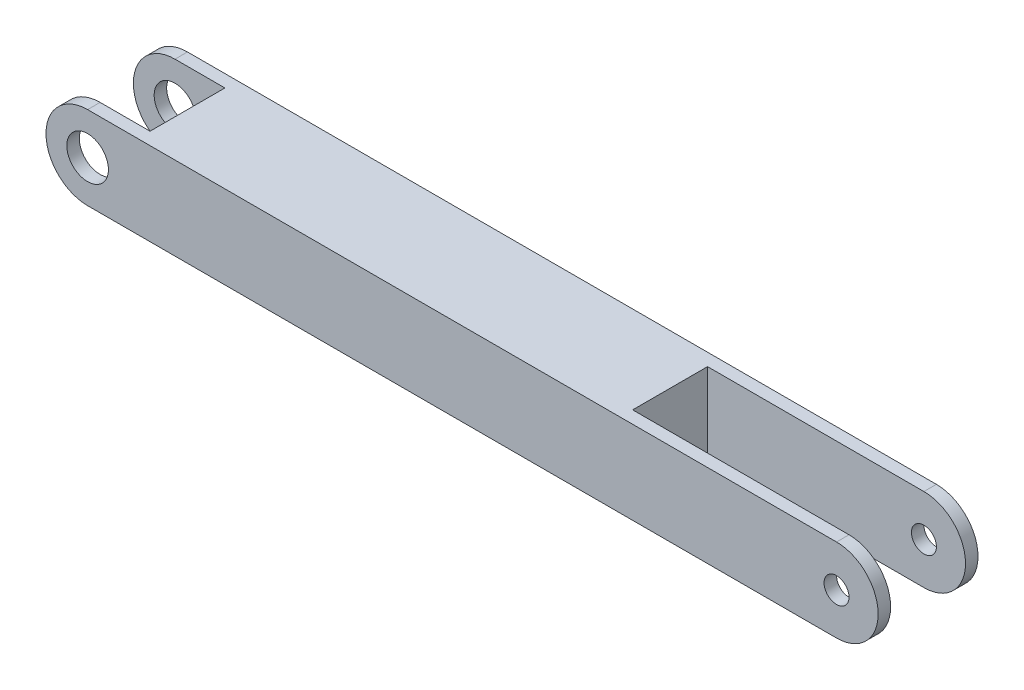
ISO-10303-21;
HEADER;
FILE_DESCRIPTION(('STEP AP214'),'2;1');
FILE_NAME('part.step','',(''),(''),'','','');
FILE_SCHEMA(('AUTOMOTIVE_DESIGN { 1 0 10303 214 1 1 1 1 }'));
ENDSEC;
DATA;
#1=APPLICATION_CONTEXT('core data for automotive mechanical design processes');
#2=APPLICATION_PROTOCOL_DEFINITION('international standard','automotive_design',2000,#1);
#3=PRODUCT_CONTEXT('',#1,'mechanical');
#4=PRODUCT('Part','Part','',(#3));
#5=PRODUCT_RELATED_PRODUCT_CATEGORY('part','',(#4));
#6=PRODUCT_DEFINITION_FORMATION('','',#4);
#7=PRODUCT_DEFINITION_CONTEXT('part definition',#1,'design');
#8=PRODUCT_DEFINITION('design','',#6,#7);
#9=PRODUCT_DEFINITION_SHAPE('','',#8);
#10=(LENGTH_UNIT() NAMED_UNIT(*) SI_UNIT(.MILLI.,.METRE.));
#11=(NAMED_UNIT(*) PLANE_ANGLE_UNIT() SI_UNIT($,.RADIAN.));
#12=(NAMED_UNIT(*) SI_UNIT($,.STERADIAN.) SOLID_ANGLE_UNIT());
#13=UNCERTAINTY_MEASURE_WITH_UNIT(LENGTH_MEASURE(1.E-05),#10,'distance_accuracy_value','');
#14=(GEOMETRIC_REPRESENTATION_CONTEXT(3) GLOBAL_UNCERTAINTY_ASSIGNED_CONTEXT((#13)) GLOBAL_UNIT_ASSIGNED_CONTEXT((#10,
#11,#12)) REPRESENTATION_CONTEXT('',''));
#15=CARTESIAN_POINT('',(0.,0.,0.));
#16=DIRECTION('',(0.,0.,1.));
#17=DIRECTION('',(1.,0.,0.));
#18=AXIS2_PLACEMENT_3D('',#15,#16,#17);
#19=CARTESIAN_POINT('',(-50.9160305343512,10.5343511450382,6.));
#20=DIRECTION('',(0.,0.,-1.));
#21=DIRECTION('',(-1.,0.,0.));
#22=AXIS2_PLACEMENT_3D('',#19,#20,#21);
#23=CYLINDRICAL_SURFACE('',#22,5.);
#24=CARTESIAN_POINT('',(-50.9160305343512,10.5343511450382,-4.5));
#25=DIRECTION('',(0.,0.,1.));
#26=DIRECTION('',(1.,0.,0.));
#27=AXIS2_PLACEMENT_3D('',#24,#25,#26);
#28=CIRCLE('',#27,5.);
#29=CARTESIAN_POINT('',(-50.9160305343512,15.5343511450382,-4.5));
#30=VERTEX_POINT('',#29);
#31=CARTESIAN_POINT('',(-50.9160305343512,5.53435114503817,-4.5));
#32=VERTEX_POINT('',#31);
#33=EDGE_CURVE('E221',#30,#32,#28,.T.);
#34=ORIENTED_EDGE('',*,*,#33,.F.);
#35=DIRECTION('',(0.,0.,-1.));
#36=VECTOR('',#35,1.);
#37=CARTESIAN_POINT('',(-50.9160305343512,15.5343511450382,6.));
#38=LINE('',#37,#36);
#39=CARTESIAN_POINT('',(-50.9160305343512,15.5343511450382,-6.));
#40=VERTEX_POINT('',#39);
#41=EDGE_CURVE('E164',#30,#40,#38,.T.);
#42=ORIENTED_EDGE('',*,*,#41,.T.);
#43=CARTESIAN_POINT('',(-50.9160305343512,10.5343511450382,-6.));
#44=DIRECTION('',(0.,0.,1.));
#45=DIRECTION('',(1.,0.,0.));
#46=AXIS2_PLACEMENT_3D('',#43,#44,#45);
#47=CIRCLE('',#46,5.);
#48=CARTESIAN_POINT('',(-50.9160305343512,5.53435114503817,-6.));
#49=VERTEX_POINT('',#48);
#50=EDGE_CURVE('E205',#40,#49,#47,.T.);
#51=ORIENTED_EDGE('',*,*,#50,.T.);
#52=DIRECTION('',(0.,0.,-1.));
#53=VECTOR('',#52,1.);
#54=CARTESIAN_POINT('',(-50.9160305343512,5.53435114503817,6.));
#55=LINE('',#54,#53);
#56=EDGE_CURVE('E48',#32,#49,#55,.T.);
#57=ORIENTED_EDGE('',*,*,#56,.F.);
#58=EDGE_LOOP('',(#34,#42,#51,#57));
#59=FACE_BOUND('',#58,.T.);
#60=ADVANCED_FACE('F39',(#59),#23,.T.);
#61=CARTESIAN_POINT('',(-50.9160305343512,5.53435114503817,6.));
#62=DIRECTION('',(0.,1.,0.));
#63=DIRECTION('',(0.,0.,1.));
#64=AXIS2_PLACEMENT_3D('',#61,#62,#63);
#65=PLANE('',#64);
#66=DIRECTION('',(0.,0.,-1.));
#67=VECTOR('',#66,1.);
#68=CARTESIAN_POINT('',(39.0839694656488,5.53435114503817,6.));
#69=LINE('',#68,#67);
#70=CARTESIAN_POINT('',(39.0839694656488,5.53435114503817,-4.5));
#71=VERTEX_POINT('',#70);
#72=CARTESIAN_POINT('',(39.0839694656488,5.53435114503817,-6.));
#73=VERTEX_POINT('',#72);
#74=EDGE_CURVE('E162',#71,#73,#69,.T.);
#75=ORIENTED_EDGE('',*,*,#74,.F.);
#76=DIRECTION('',(1.,0.,0.));
#77=VECTOR('',#76,1.);
#78=CARTESIAN_POINT('',(13.0839694656489,5.53435114503817,-4.5));
#79=LINE('',#78,#77);
#80=CARTESIAN_POINT('',(13.0839694656489,5.53435114503817,-4.5));
#81=VERTEX_POINT('',#80);
#82=EDGE_CURVE('E139',#81,#71,#79,.T.);
#83=ORIENTED_EDGE('',*,*,#82,.F.);
#84=DIRECTION('',(0.,0.,1.));
#85=VECTOR('',#84,1.);
#86=CARTESIAN_POINT('',(13.0839694656489,5.53435114503817,-4.5));
#87=LINE('',#86,#85);
#88=CARTESIAN_POINT('',(13.0839694656489,5.53435114503817,4.5));
#89=VERTEX_POINT('',#88);
#90=EDGE_CURVE('E175',#81,#89,#87,.T.);
#91=ORIENTED_EDGE('',*,*,#90,.T.);
#92=DIRECTION('',(1.,0.,0.));
#93=VECTOR('',#92,1.);
#94=CARTESIAN_POINT('',(13.0839694656489,5.53435114503817,4.5));
#95=LINE('',#94,#93);
#96=CARTESIAN_POINT('',(39.0839694656488,5.53435114503817,4.5));
#97=VERTEX_POINT('',#96);
#98=EDGE_CURVE('E143',#89,#97,#95,.T.);
#99=ORIENTED_EDGE('',*,*,#98,.T.);
#100=CARTESIAN_POINT('',(39.0839694656488,5.53435114503817,6.));
#101=VERTEX_POINT('',#100);
#102=EDGE_CURVE('E168',#101,#97,#69,.T.);
#103=ORIENTED_EDGE('',*,*,#102,.F.);
#104=DIRECTION('',(1.,0.,0.));
#105=VECTOR('',#104,1.);
#106=CARTESIAN_POINT('',(-50.9160305343512,5.53435114503817,6.));
#107=LINE('',#106,#105);
#108=CARTESIAN_POINT('',(-50.9160305343512,5.53435114503817,6.));
#109=VERTEX_POINT('',#108);
#110=EDGE_CURVE('E198',#109,#101,#107,.T.);
#111=ORIENTED_EDGE('',*,*,#110,.F.);
#112=CARTESIAN_POINT('',(-50.9160305343512,5.53435114503817,4.5));
#113=VERTEX_POINT('',#112);
#114=EDGE_CURVE('E11',#109,#113,#55,.T.);
#115=ORIENTED_EDGE('',*,*,#114,.T.);
#116=DIRECTION('',(1.,0.,0.));
#117=VECTOR('',#116,1.);
#118=CARTESIAN_POINT('',(-44.9160305343512,5.53435114503817,4.5));
#119=LINE('',#118,#117);
#120=CARTESIAN_POINT('',(-44.9160305343512,5.53435114503817,4.5));
#121=VERTEX_POINT('',#120);
#122=EDGE_CURVE('E256',#113,#121,#119,.T.);
#123=ORIENTED_EDGE('',*,*,#122,.T.);
#124=DIRECTION('',(0.,0.,1.));
#125=VECTOR('',#124,1.);
#126=CARTESIAN_POINT('',(-44.9160305343512,5.53435114503817,-4.5));
#127=LINE('',#126,#125);
#128=CARTESIAN_POINT('',(-44.9160305343512,5.53435114503817,-4.5));
#129=VERTEX_POINT('',#128);
#130=EDGE_CURVE('E277',#129,#121,#127,.T.);
#131=ORIENTED_EDGE('',*,*,#130,.F.);
#132=DIRECTION('',(1.,0.,0.));
#133=VECTOR('',#132,1.);
#134=CARTESIAN_POINT('',(-44.9160305343512,5.53435114503817,-4.5));
#135=LINE('',#134,#133);
#136=EDGE_CURVE('E226',#32,#129,#135,.T.);
#137=ORIENTED_EDGE('',*,*,#136,.F.);
#138=ORIENTED_EDGE('',*,*,#56,.T.);
#139=DIRECTION('',(1.,0.,0.));
#140=VECTOR('',#139,1.);
#141=CARTESIAN_POINT('',(-50.9160305343512,5.53435114503817,-6.));
#142=LINE('',#141,#140);
#143=EDGE_CURVE('E208',#49,#73,#142,.T.);
#144=ORIENTED_EDGE('',*,*,#143,.T.);
#145=EDGE_LOOP('',(#75,#83,#91,#99,#103,#111,#115,#123,#131,#137,#138,#144));
#146=FACE_BOUND('',#145,.T.);
#147=ADVANCED_FACE('F254',(#146),#65,.F.);
#148=CARTESIAN_POINT('',(39.0839694656488,10.5343511450382,6.));
#149=DIRECTION('',(0.,0.,-1.));
#150=DIRECTION('',(-1.,0.,0.));
#151=AXIS2_PLACEMENT_3D('',#148,#149,#150);
#152=CYLINDRICAL_SURFACE('',#151,5.);
#153=CARTESIAN_POINT('',(39.0839694656488,10.5343511450382,4.5));
#154=DIRECTION('',(0.,0.,1.));
#155=DIRECTION('',(-1.,0.,0.));
#156=AXIS2_PLACEMENT_3D('',#153,#154,#155);
#157=CIRCLE('',#156,5.);
#158=CARTESIAN_POINT('',(39.0839694656488,15.5343511450382,4.5));
#159=VERTEX_POINT('',#158);
#160=EDGE_CURVE('E264',#97,#159,#157,.T.);
#161=ORIENTED_EDGE('',*,*,#160,.T.);
#162=DIRECTION('',(0.,0.,-1.));
#163=VECTOR('',#162,1.);
#164=CARTESIAN_POINT('',(39.0839694656488,15.5343511450382,6.));
#165=LINE('',#164,#163);
#166=CARTESIAN_POINT('',(39.0839694656488,15.5343511450382,6.));
#167=VERTEX_POINT('',#166);
#168=EDGE_CURVE('E158',#167,#159,#165,.T.);
#169=ORIENTED_EDGE('',*,*,#168,.F.);
#170=CARTESIAN_POINT('',(39.0839694656488,10.5343511450382,6.));
#171=DIRECTION('',(0.,0.,1.));
#172=DIRECTION('',(-1.,0.,0.));
#173=AXIS2_PLACEMENT_3D('',#170,#171,#172);
#174=CIRCLE('',#173,5.);
#175=EDGE_CURVE('E201',#101,#167,#174,.T.);
#176=ORIENTED_EDGE('',*,*,#175,.F.);
#177=ORIENTED_EDGE('',*,*,#102,.T.);
#178=EDGE_LOOP('',(#161,#169,#176,#177));
#179=FACE_BOUND('',#178,.T.);
#180=ADVANCED_FACE('F263',(#179),#152,.T.);
#181=CARTESIAN_POINT('',(-50.9160305343512,15.5343511450382,6.));
#182=DIRECTION('',(0.,-1.,0.));
#183=DIRECTION('',(0.,0.,-1.));
#184=AXIS2_PLACEMENT_3D('',#181,#182,#183);
#185=PLANE('',#184);
#186=DIRECTION('',(0.,0.,1.));
#187=VECTOR('',#186,1.);
#188=CARTESIAN_POINT('',(13.0839694656489,15.5343511450382,-4.5));
#189=LINE('',#188,#187);
#190=CARTESIAN_POINT('',(13.0839694656489,15.5343511450382,-4.5));
#191=VERTEX_POINT('',#190);
#192=CARTESIAN_POINT('',(13.0839694656489,15.5343511450382,4.5));
#193=VERTEX_POINT('',#192);
#194=EDGE_CURVE('E151',#191,#193,#189,.T.);
#195=ORIENTED_EDGE('',*,*,#194,.F.);
#196=DIRECTION('',(-1.,0.,0.));
#197=VECTOR('',#196,1.);
#198=CARTESIAN_POINT('',(39.0839694656488,15.5343511450382,-4.5));
#199=LINE('',#198,#197);
#200=CARTESIAN_POINT('',(39.0839694656488,15.5343511450382,-4.5));
#201=VERTEX_POINT('',#200);
#202=EDGE_CURVE('E136',#201,#191,#199,.T.);
#203=ORIENTED_EDGE('',*,*,#202,.F.);
#204=CARTESIAN_POINT('',(39.0839694656488,15.5343511450382,-6.));
#205=VERTEX_POINT('',#204);
#206=EDGE_CURVE('E148',#201,#205,#165,.T.);
#207=ORIENTED_EDGE('',*,*,#206,.T.);
#208=DIRECTION('',(-1.,0.,0.));
#209=VECTOR('',#208,1.);
#210=CARTESIAN_POINT('',(-50.9160305343512,15.5343511450382,-6.));
#211=LINE('',#210,#209);
#212=EDGE_CURVE('E199',#205,#40,#211,.T.);
#213=ORIENTED_EDGE('',*,*,#212,.T.);
#214=ORIENTED_EDGE('',*,*,#41,.F.);
#215=DIRECTION('',(-1.,0.,0.));
#216=VECTOR('',#215,1.);
#217=CARTESIAN_POINT('',(-50.9160305343512,15.5343511450382,-4.5));
#218=LINE('',#217,#216);
#219=CARTESIAN_POINT('',(-44.9160305343512,15.5343511450382,-4.5));
#220=VERTEX_POINT('',#219);
#221=EDGE_CURVE('E276',#220,#30,#218,.T.);
#222=ORIENTED_EDGE('',*,*,#221,.F.);
#223=DIRECTION('',(0.,0.,1.));
#224=VECTOR('',#223,1.);
#225=CARTESIAN_POINT('',(-44.9160305343512,15.5343511450382,-4.5));
#226=LINE('',#225,#224);
#227=CARTESIAN_POINT('',(-44.9160305343512,15.5343511450382,4.5));
#228=VERTEX_POINT('',#227);
#229=EDGE_CURVE('E266',#220,#228,#226,.T.);
#230=ORIENTED_EDGE('',*,*,#229,.T.);
#231=DIRECTION('',(-1.,0.,0.));
#232=VECTOR('',#231,1.);
#233=CARTESIAN_POINT('',(-50.9160305343512,15.5343511450382,4.5));
#234=LINE('',#233,#232);
#235=CARTESIAN_POINT('',(-50.9160305343512,15.5343511450382,4.5));
#236=VERTEX_POINT('',#235);
#237=EDGE_CURVE('E225',#228,#236,#234,.T.);
#238=ORIENTED_EDGE('',*,*,#237,.T.);
#239=CARTESIAN_POINT('',(-50.9160305343512,15.5343511450382,6.));
#240=VERTEX_POINT('',#239);
#241=EDGE_CURVE('E159',#240,#236,#38,.T.);
#242=ORIENTED_EDGE('',*,*,#241,.F.);
#243=DIRECTION('',(-1.,0.,0.));
#244=VECTOR('',#243,1.);
#245=CARTESIAN_POINT('',(-50.9160305343512,15.5343511450382,6.));
#246=LINE('',#245,#244);
#247=EDGE_CURVE('E203',#167,#240,#246,.T.);
#248=ORIENTED_EDGE('',*,*,#247,.F.);
#249=ORIENTED_EDGE('',*,*,#168,.T.);
#250=DIRECTION('',(-1.,0.,0.));
#251=VECTOR('',#250,1.);
#252=CARTESIAN_POINT('',(39.0839694656488,15.5343511450382,4.5));
#253=LINE('',#252,#251);
#254=EDGE_CURVE('E288',#159,#193,#253,.T.);
#255=ORIENTED_EDGE('',*,*,#254,.T.);
#256=EDGE_LOOP('',(#195,#203,#207,#213,#214,#222,#230,#238,#242,#248,#249,#255));
#257=FACE_BOUND('',#256,.T.);
#258=ADVANCED_FACE('F146',(#257),#185,.F.);
#259=CARTESIAN_POINT('',(39.0839694656488,10.5343511450382,-6.));
#260=DIRECTION('',(0.,0.,1.));
#261=DIRECTION('',(1.,0.,0.));
#262=AXIS2_PLACEMENT_3D('',#259,#260,#261);
#263=CYLINDRICAL_SURFACE('',#262,1.5);
#264=CARTESIAN_POINT('',(39.0839694656488,10.5343511450382,6.));
#265=DIRECTION('',(0.,0.,1.));
#266=DIRECTION('',(1.,0.,0.));
#267=AXIS2_PLACEMENT_3D('',#264,#265,#266);
#268=CIRCLE('',#267,1.5);
#269=CARTESIAN_POINT('',(40.5839694656488,10.5343511450382,6.));
#270=VERTEX_POINT('',#269);
#271=EDGE_CURVE('E186',#270,#270,#268,.T.);
#272=ORIENTED_EDGE('',*,*,#271,.T.);
#273=EDGE_LOOP('',(#272));
#274=FACE_BOUND('',#273,.T.);
#275=CARTESIAN_POINT('',(39.0839694656488,10.5343511450382,4.5));
#276=DIRECTION('',(0.,0.,-1.));
#277=DIRECTION('',(-1.,0.,0.));
#278=AXIS2_PLACEMENT_3D('',#275,#276,#277);
#279=CIRCLE('',#278,1.5);
#280=CARTESIAN_POINT('',(37.5839694656488,10.5343511450382,4.5));
#281=VERTEX_POINT('',#280);
#282=EDGE_CURVE('E177',#281,#281,#279,.F.);
#283=ORIENTED_EDGE('',*,*,#282,.F.);
#284=EDGE_LOOP('',(#283));
#285=FACE_BOUND('',#284,.T.);
#286=ADVANCED_FACE('F315',(#274,#285),#263,.F.);
#287=CARTESIAN_POINT('',(-50.9160305343512,10.5343511450382,-6.));
#288=DIRECTION('',(0.,0.,1.));
#289=DIRECTION('',(1.,0.,0.));
#290=AXIS2_PLACEMENT_3D('',#287,#288,#289);
#291=CYLINDRICAL_SURFACE('',#290,2.5);
#292=CARTESIAN_POINT('',(-50.9160305343512,10.5343511450382,-6.));
#293=DIRECTION('',(0.,0.,1.));
#294=DIRECTION('',(1.,0.,0.));
#295=AXIS2_PLACEMENT_3D('',#292,#293,#294);
#296=CIRCLE('',#295,2.5);
#297=CARTESIAN_POINT('',(-48.4160305343511,10.5343511450382,-6.));
#298=VERTEX_POINT('',#297);
#299=EDGE_CURVE('E209',#298,#298,#296,.T.);
#300=ORIENTED_EDGE('',*,*,#299,.F.);
#301=EDGE_LOOP('',(#300));
#302=FACE_BOUND('',#301,.T.);
#303=CARTESIAN_POINT('',(-50.9160305343512,10.5343511450382,-4.5));
#304=DIRECTION('',(0.,0.,1.));
#305=DIRECTION('',(1.,0.,0.));
#306=AXIS2_PLACEMENT_3D('',#303,#304,#305);
#307=CIRCLE('',#306,2.5);
#308=CARTESIAN_POINT('',(-48.4160305343511,10.5343511450382,-4.5));
#309=VERTEX_POINT('',#308);
#310=EDGE_CURVE('E174',#309,#309,#307,.F.);
#311=ORIENTED_EDGE('',*,*,#310,.F.);
#312=EDGE_LOOP('',(#311));
#313=FACE_BOUND('',#312,.T.);
#314=ADVANCED_FACE('F309',(#302,#313),#291,.F.);
#315=ORIENTED_EDGE('',*,*,#241,.T.);
#316=CARTESIAN_POINT('',(-50.9160305343512,10.5343511450382,4.5));
#317=DIRECTION('',(0.,0.,1.));
#318=DIRECTION('',(1.,0.,0.));
#319=AXIS2_PLACEMENT_3D('',#316,#317,#318);
#320=CIRCLE('',#319,5.);
#321=EDGE_CURVE('E64',#236,#113,#320,.T.);
#322=ORIENTED_EDGE('',*,*,#321,.T.);
#323=ORIENTED_EDGE('',*,*,#114,.F.);
#324=CARTESIAN_POINT('',(-50.9160305343512,10.5343511450382,6.));
#325=DIRECTION('',(0.,0.,1.));
#326=DIRECTION('',(1.,0.,0.));
#327=AXIS2_PLACEMENT_3D('',#324,#325,#326);
#328=CIRCLE('',#327,5.);
#329=EDGE_CURVE('E195',#240,#109,#328,.T.);
#330=ORIENTED_EDGE('',*,*,#329,.F.);
#331=EDGE_LOOP('',(#315,#322,#323,#330));
#332=FACE_BOUND('',#331,.T.);
#333=ADVANCED_FACE('F41',(#332),#23,.T.);
#334=ORIENTED_EDGE('',*,*,#206,.F.);
#335=CARTESIAN_POINT('',(39.0839694656488,10.5343511450382,-4.5));
#336=DIRECTION('',(0.,0.,1.));
#337=DIRECTION('',(-1.,0.,0.));
#338=AXIS2_PLACEMENT_3D('',#335,#336,#337);
#339=CIRCLE('',#338,5.);
#340=EDGE_CURVE('E131',#71,#201,#339,.T.);
#341=ORIENTED_EDGE('',*,*,#340,.F.);
#342=ORIENTED_EDGE('',*,*,#74,.T.);
#343=CARTESIAN_POINT('',(39.0839694656488,10.5343511450382,-6.));
#344=DIRECTION('',(0.,0.,1.));
#345=DIRECTION('',(-1.,0.,0.));
#346=AXIS2_PLACEMENT_3D('',#343,#344,#345);
#347=CIRCLE('',#346,5.);
#348=EDGE_CURVE('E156',#73,#205,#347,.T.);
#349=ORIENTED_EDGE('',*,*,#348,.T.);
#350=EDGE_LOOP('',(#334,#341,#342,#349));
#351=FACE_BOUND('',#350,.T.);
#352=ADVANCED_FACE('F154',(#351),#152,.T.);
#353=CARTESIAN_POINT('',(-50.9160305343512,10.5343511450382,6.));
#354=DIRECTION('',(0.,0.,1.));
#355=DIRECTION('',(1.,0.,0.));
#356=AXIS2_PLACEMENT_3D('',#353,#354,#355);
#357=PLANE('',#356);
#358=CARTESIAN_POINT('',(-50.9160305343512,10.5343511450382,6.));
#359=DIRECTION('',(0.,0.,1.));
#360=DIRECTION('',(1.,0.,0.));
#361=AXIS2_PLACEMENT_3D('',#358,#359,#360);
#362=CIRCLE('',#361,2.5);
#363=CARTESIAN_POINT('',(-48.4160305343511,10.5343511450382,6.));
#364=VERTEX_POINT('',#363);
#365=EDGE_CURVE('E191',#364,#364,#362,.T.);
#366=ORIENTED_EDGE('',*,*,#365,.F.);
#367=EDGE_LOOP('',(#366));
#368=FACE_BOUND('',#367,.T.);
#369=ORIENTED_EDGE('',*,*,#271,.F.);
#370=EDGE_LOOP('',(#369));
#371=FACE_BOUND('',#370,.T.);
#372=ORIENTED_EDGE('',*,*,#329,.T.);
#373=ORIENTED_EDGE('',*,*,#110,.T.);
#374=ORIENTED_EDGE('',*,*,#175,.T.);
#375=ORIENTED_EDGE('',*,*,#247,.T.);
#376=EDGE_LOOP('',(#372,#373,#374,#375));
#377=FACE_BOUND('',#376,.T.);
#378=ADVANCED_FACE('F240',(#368,#371,#377),#357,.T.);
#379=CARTESIAN_POINT('',(-50.9160305343512,10.5343511450382,-6.));
#380=DIRECTION('',(0.,0.,1.));
#381=DIRECTION('',(1.,0.,0.));
#382=AXIS2_PLACEMENT_3D('',#379,#380,#381);
#383=PLANE('',#382);
#384=ORIENTED_EDGE('',*,*,#299,.T.);
#385=EDGE_LOOP('',(#384));
#386=FACE_BOUND('',#385,.T.);
#387=CARTESIAN_POINT('',(39.0839694656488,10.5343511450382,-6.));
#388=DIRECTION('',(0.,0.,1.));
#389=DIRECTION('',(1.,0.,0.));
#390=AXIS2_PLACEMENT_3D('',#387,#388,#389);
#391=CIRCLE('',#390,1.5);
#392=CARTESIAN_POINT('',(40.5839694656488,10.5343511450382,-6.));
#393=VERTEX_POINT('',#392);
#394=EDGE_CURVE('E182',#393,#393,#391,.T.);
#395=ORIENTED_EDGE('',*,*,#394,.T.);
#396=EDGE_LOOP('',(#395));
#397=FACE_BOUND('',#396,.T.);
#398=ORIENTED_EDGE('',*,*,#50,.F.);
#399=ORIENTED_EDGE('',*,*,#212,.F.);
#400=ORIENTED_EDGE('',*,*,#348,.F.);
#401=ORIENTED_EDGE('',*,*,#143,.F.);
#402=EDGE_LOOP('',(#398,#399,#400,#401));
#403=FACE_BOUND('',#402,.T.);
#404=ADVANCED_FACE('F217',(#386,#397,#403),#383,.F.);
#405=CARTESIAN_POINT('',(39.0839694656488,10.5343511450382,-4.5));
#406=DIRECTION('',(0.,0.,-1.));
#407=DIRECTION('',(-1.,0.,0.));
#408=AXIS2_PLACEMENT_3D('',#405,#406,#407);
#409=CIRCLE('',#408,1.5);
#410=CARTESIAN_POINT('',(37.5839694656488,10.5343511450382,-4.5));
#411=VERTEX_POINT('',#410);
#412=EDGE_CURVE('E43',#411,#411,#409,.F.);
#413=ORIENTED_EDGE('',*,*,#412,.T.);
#414=EDGE_LOOP('',(#413));
#415=FACE_BOUND('',#414,.T.);
#416=ORIENTED_EDGE('',*,*,#394,.F.);
#417=EDGE_LOOP('',(#416));
#418=FACE_BOUND('',#417,.T.);
#419=ADVANCED_FACE('F323',(#415,#418),#263,.F.);
#420=CARTESIAN_POINT('',(-50.9160305343512,10.5343511450382,4.5));
#421=DIRECTION('',(0.,0.,1.));
#422=DIRECTION('',(1.,0.,0.));
#423=AXIS2_PLACEMENT_3D('',#420,#421,#422);
#424=CIRCLE('',#423,2.5);
#425=CARTESIAN_POINT('',(-48.4160305343511,10.5343511450382,4.5));
#426=VERTEX_POINT('',#425);
#427=EDGE_CURVE('E171',#426,#426,#424,.F.);
#428=ORIENTED_EDGE('',*,*,#427,.T.);
#429=EDGE_LOOP('',(#428));
#430=FACE_BOUND('',#429,.T.);
#431=ORIENTED_EDGE('',*,*,#365,.T.);
#432=EDGE_LOOP('',(#431));
#433=FACE_BOUND('',#432,.T.);
#434=ADVANCED_FACE('F238',(#430,#433),#291,.F.);
#435=CARTESIAN_POINT('',(-50.9160305343512,10.5343511450382,-4.5));
#436=DIRECTION('',(0.,0.,1.));
#437=DIRECTION('',(1.,0.,0.));
#438=AXIS2_PLACEMENT_3D('',#435,#436,#437);
#439=PLANE('',#438);
#440=ORIENTED_EDGE('',*,*,#33,.T.);
#441=ORIENTED_EDGE('',*,*,#136,.T.);
#442=DIRECTION('',(0.,1.,0.));
#443=VECTOR('',#442,1.);
#444=CARTESIAN_POINT('',(-44.9160305343512,15.5343511450382,-4.5));
#445=LINE('',#444,#443);
#446=EDGE_CURVE('E230',#129,#220,#445,.T.);
#447=ORIENTED_EDGE('',*,*,#446,.T.);
#448=ORIENTED_EDGE('',*,*,#221,.T.);
#449=EDGE_LOOP('',(#440,#441,#447,#448));
#450=FACE_BOUND('',#449,.T.);
#451=ORIENTED_EDGE('',*,*,#310,.T.);
#452=EDGE_LOOP('',(#451));
#453=FACE_BOUND('',#452,.T.);
#454=ADVANCED_FACE('F279',(#450,#453),#439,.T.);
#455=CARTESIAN_POINT('',(-50.9160305343512,10.5343511450382,4.5));
#456=DIRECTION('',(0.,0.,1.));
#457=DIRECTION('',(1.,0.,0.));
#458=AXIS2_PLACEMENT_3D('',#455,#456,#457);
#459=PLANE('',#458);
#460=ORIENTED_EDGE('',*,*,#321,.F.);
#461=ORIENTED_EDGE('',*,*,#237,.F.);
#462=DIRECTION('',(0.,1.,0.));
#463=VECTOR('',#462,1.);
#464=CARTESIAN_POINT('',(-44.9160305343512,15.5343511450382,4.5));
#465=LINE('',#464,#463);
#466=EDGE_CURVE('E228',#121,#228,#465,.T.);
#467=ORIENTED_EDGE('',*,*,#466,.F.);
#468=ORIENTED_EDGE('',*,*,#122,.F.);
#469=EDGE_LOOP('',(#460,#461,#467,#468));
#470=FACE_BOUND('',#469,.T.);
#471=ORIENTED_EDGE('',*,*,#427,.F.);
#472=EDGE_LOOP('',(#471));
#473=FACE_BOUND('',#472,.T.);
#474=ADVANCED_FACE('F268',(#470,#473),#459,.F.);
#475=CARTESIAN_POINT('',(-44.9160305343512,15.5343511450382,-4.5));
#476=DIRECTION('',(1.,0.,0.));
#477=DIRECTION('',(0.,0.,-1.));
#478=AXIS2_PLACEMENT_3D('',#475,#476,#477);
#479=PLANE('',#478);
#480=ORIENTED_EDGE('',*,*,#466,.T.);
#481=ORIENTED_EDGE('',*,*,#229,.F.);
#482=ORIENTED_EDGE('',*,*,#446,.F.);
#483=ORIENTED_EDGE('',*,*,#130,.T.);
#484=EDGE_LOOP('',(#480,#481,#482,#483));
#485=FACE_BOUND('',#484,.T.);
#486=ADVANCED_FACE('F281',(#485),#479,.F.);
#487=CARTESIAN_POINT('',(39.0839694656488,10.5343511450382,-4.5));
#488=DIRECTION('',(0.,0.,-1.));
#489=DIRECTION('',(-1.,0.,0.));
#490=AXIS2_PLACEMENT_3D('',#487,#488,#489);
#491=PLANE('',#490);
#492=ORIENTED_EDGE('',*,*,#340,.T.);
#493=ORIENTED_EDGE('',*,*,#202,.T.);
#494=DIRECTION('',(0.,-1.,0.));
#495=VECTOR('',#494,1.);
#496=CARTESIAN_POINT('',(13.0839694656489,15.5343511450382,-4.5));
#497=LINE('',#496,#495);
#498=EDGE_CURVE('E152',#191,#81,#497,.T.);
#499=ORIENTED_EDGE('',*,*,#498,.T.);
#500=ORIENTED_EDGE('',*,*,#82,.T.);
#501=EDGE_LOOP('',(#492,#493,#499,#500));
#502=FACE_BOUND('',#501,.T.);
#503=ORIENTED_EDGE('',*,*,#412,.F.);
#504=EDGE_LOOP('',(#503));
#505=FACE_BOUND('',#504,.T.);
#506=ADVANCED_FACE('F133',(#502,#505),#491,.F.);
#507=CARTESIAN_POINT('',(39.0839694656488,10.5343511450382,4.5));
#508=DIRECTION('',(0.,0.,-1.));
#509=DIRECTION('',(-1.,0.,0.));
#510=AXIS2_PLACEMENT_3D('',#507,#508,#509);
#511=PLANE('',#510);
#512=ORIENTED_EDGE('',*,*,#160,.F.);
#513=ORIENTED_EDGE('',*,*,#98,.F.);
#514=DIRECTION('',(0.,-1.,0.));
#515=VECTOR('',#514,1.);
#516=CARTESIAN_POINT('',(13.0839694656489,15.5343511450382,4.5));
#517=LINE('',#516,#515);
#518=EDGE_CURVE('E56',#193,#89,#517,.T.);
#519=ORIENTED_EDGE('',*,*,#518,.F.);
#520=ORIENTED_EDGE('',*,*,#254,.F.);
#521=EDGE_LOOP('',(#512,#513,#519,#520));
#522=FACE_BOUND('',#521,.T.);
#523=ORIENTED_EDGE('',*,*,#282,.T.);
#524=EDGE_LOOP('',(#523));
#525=FACE_BOUND('',#524,.T.);
#526=ADVANCED_FACE('F294',(#522,#525),#511,.T.);
#527=CARTESIAN_POINT('',(13.0839694656489,15.5343511450382,-4.5));
#528=DIRECTION('',(-1.,0.,0.));
#529=DIRECTION('',(0.,-1.,0.));
#530=AXIS2_PLACEMENT_3D('',#527,#528,#529);
#531=PLANE('',#530);
#532=ORIENTED_EDGE('',*,*,#518,.T.);
#533=ORIENTED_EDGE('',*,*,#90,.F.);
#534=ORIENTED_EDGE('',*,*,#498,.F.);
#535=ORIENTED_EDGE('',*,*,#194,.T.);
#536=EDGE_LOOP('',(#532,#533,#534,#535));
#537=FACE_BOUND('',#536,.T.);
#538=ADVANCED_FACE('F293',(#537),#531,.F.);
#539=CLOSED_SHELL('',(#60,#147,#180,#258,#286,#314,#333,#352,#378,#404,#419,#434,#454,#474,#486,
#506,#526,#538));
#540=MANIFOLD_SOLID_BREP('B2',#539);
#541=ADVANCED_BREP_SHAPE_REPRESENTATION('',(#18,#540),#14);
#542=SHAPE_DEFINITION_REPRESENTATION(#9,#541);
ENDSEC;
END-ISO-10303-21;
